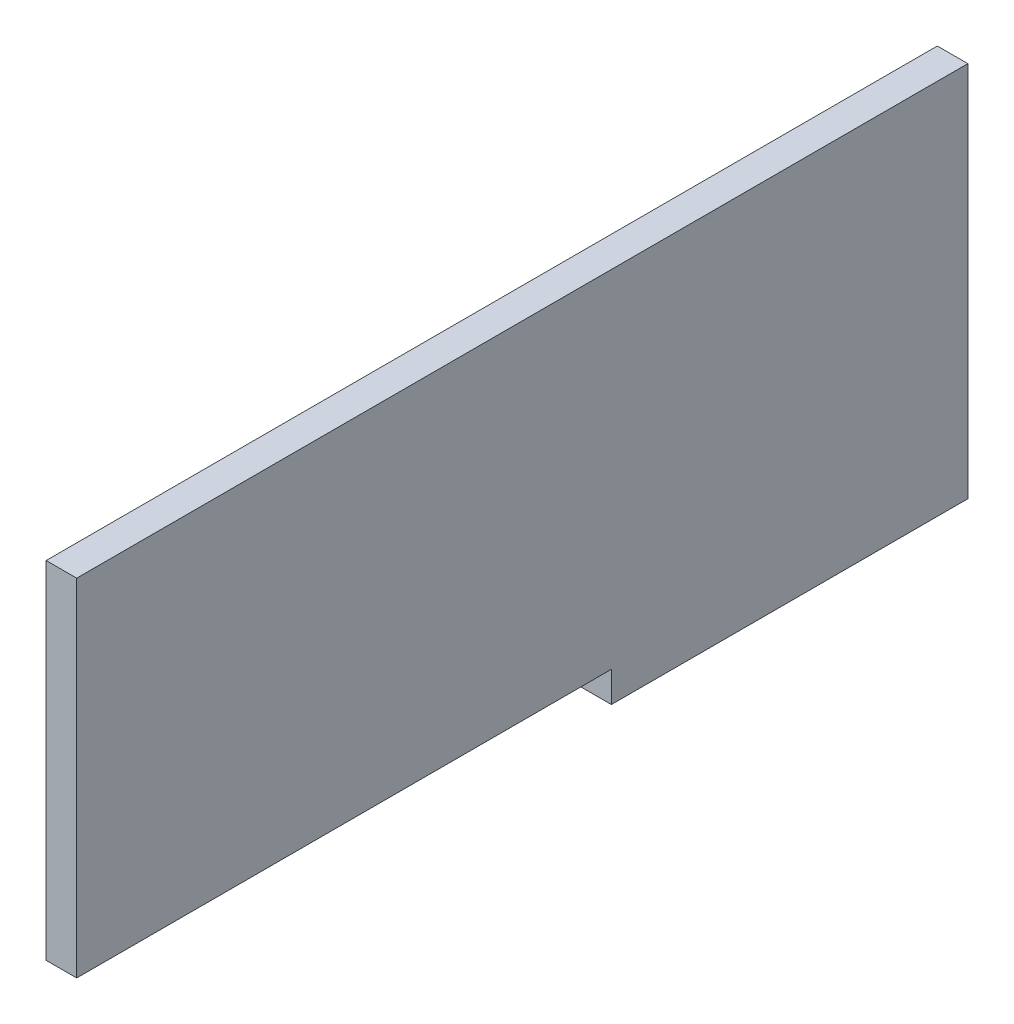
ISO-10303-21;
HEADER;
FILE_DESCRIPTION(('STEP AP214'),'2;1');
FILE_NAME('part.step','',(''),(''),'','','');
FILE_SCHEMA(('AUTOMOTIVE_DESIGN { 1 0 10303 214 1 1 1 1 }'));
ENDSEC;
DATA;
#1=APPLICATION_CONTEXT('core data for automotive mechanical design processes');
#2=APPLICATION_PROTOCOL_DEFINITION('international standard','automotive_design',2000,#1);
#3=PRODUCT_CONTEXT('',#1,'mechanical');
#4=PRODUCT('Part','Part','',(#3));
#5=PRODUCT_RELATED_PRODUCT_CATEGORY('part','',(#4));
#6=PRODUCT_DEFINITION_FORMATION('','',#4);
#7=PRODUCT_DEFINITION_CONTEXT('part definition',#1,'design');
#8=PRODUCT_DEFINITION('design','',#6,#7);
#9=PRODUCT_DEFINITION_SHAPE('','',#8);
#10=(LENGTH_UNIT() NAMED_UNIT(*) SI_UNIT(.MILLI.,.METRE.));
#11=(NAMED_UNIT(*) PLANE_ANGLE_UNIT() SI_UNIT($,.RADIAN.));
#12=(NAMED_UNIT(*) SI_UNIT($,.STERADIAN.) SOLID_ANGLE_UNIT());
#13=UNCERTAINTY_MEASURE_WITH_UNIT(LENGTH_MEASURE(1.E-05),#10,'distance_accuracy_value','');
#14=(GEOMETRIC_REPRESENTATION_CONTEXT(3) GLOBAL_UNCERTAINTY_ASSIGNED_CONTEXT((#13)) GLOBAL_UNIT_ASSIGNED_CONTEXT((#10,
#11,#12)) REPRESENTATION_CONTEXT('',''));
#15=CARTESIAN_POINT('',(0.,0.,0.));
#16=DIRECTION('',(0.,0.,1.));
#17=DIRECTION('',(1.,0.,0.));
#18=AXIS2_PLACEMENT_3D('',#15,#16,#17);
#19=CARTESIAN_POINT('',(6.,34.,87.5));
#20=DIRECTION('',(0.,-1.,0.));
#21=DIRECTION('',(0.,0.,-1.));
#22=AXIS2_PLACEMENT_3D('',#19,#20,#21);
#23=PLANE('',#22);
#24=DIRECTION('',(0.,0.,1.));
#25=VECTOR('',#24,1.);
#26=CARTESIAN_POINT('',(0.,34.,87.5));
#27=LINE('',#26,#25);
#28=CARTESIAN_POINT('',(0.,34.,-87.5));
#29=VERTEX_POINT('',#28);
#30=CARTESIAN_POINT('',(0.,34.,87.5));
#31=VERTEX_POINT('',#30);
#32=EDGE_CURVE('E121',#29,#31,#27,.T.);
#33=ORIENTED_EDGE('',*,*,#32,.T.);
#34=DIRECTION('',(-1.,0.,0.));
#35=VECTOR('',#34,1.);
#36=CARTESIAN_POINT('',(6.,34.,87.5));
#37=LINE('',#36,#35);
#38=CARTESIAN_POINT('',(6.,34.,87.5));
#39=VERTEX_POINT('',#38);
#40=EDGE_CURVE('E41',#39,#31,#37,.T.);
#41=ORIENTED_EDGE('',*,*,#40,.F.);
#42=DIRECTION('',(0.,0.,1.));
#43=VECTOR('',#42,1.);
#44=CARTESIAN_POINT('',(6.,34.,87.5));
#45=LINE('',#44,#43);
#46=CARTESIAN_POINT('',(6.,34.,-87.5));
#47=VERTEX_POINT('',#46);
#48=EDGE_CURVE('E87',#47,#39,#45,.T.);
#49=ORIENTED_EDGE('',*,*,#48,.F.);
#50=DIRECTION('',(-1.,0.,0.));
#51=VECTOR('',#50,1.);
#52=CARTESIAN_POINT('',(6.,34.,-87.5));
#53=LINE('',#52,#51);
#54=EDGE_CURVE('E11',#47,#29,#53,.T.);
#55=ORIENTED_EDGE('',*,*,#54,.T.);
#56=EDGE_LOOP('',(#33,#41,#49,#55));
#57=FACE_BOUND('',#56,.T.);
#58=ADVANCED_FACE('F33',(#57),#23,.F.);
#59=CARTESIAN_POINT('',(6.,-34.,87.5));
#60=DIRECTION('',(0.,0.,-1.));
#61=DIRECTION('',(-1.,0.,0.));
#62=AXIS2_PLACEMENT_3D('',#59,#60,#61);
#63=PLANE('',#62);
#64=DIRECTION('',(0.,-1.,0.));
#65=VECTOR('',#64,1.);
#66=CARTESIAN_POINT('',(0.,-34.,87.5));
#67=LINE('',#66,#65);
#68=CARTESIAN_POINT('',(0.,-34.,87.5));
#69=VERTEX_POINT('',#68);
#70=EDGE_CURVE('E123',#31,#69,#67,.T.);
#71=ORIENTED_EDGE('',*,*,#70,.T.);
#72=DIRECTION('',(-1.,0.,0.));
#73=VECTOR('',#72,1.);
#74=CARTESIAN_POINT('',(6.,-34.,87.5));
#75=LINE('',#74,#73);
#76=CARTESIAN_POINT('',(6.,-34.,87.5));
#77=VERTEX_POINT('',#76);
#78=EDGE_CURVE('E110',#77,#69,#75,.T.);
#79=ORIENTED_EDGE('',*,*,#78,.F.);
#80=DIRECTION('',(0.,-1.,0.));
#81=VECTOR('',#80,1.);
#82=CARTESIAN_POINT('',(6.,-34.,87.5));
#83=LINE('',#82,#81);
#84=EDGE_CURVE('E101',#39,#77,#83,.T.);
#85=ORIENTED_EDGE('',*,*,#84,.F.);
#86=ORIENTED_EDGE('',*,*,#40,.T.);
#87=EDGE_LOOP('',(#71,#79,#85,#86));
#88=FACE_BOUND('',#87,.T.);
#89=ADVANCED_FACE('F135',(#88),#63,.F.);
#90=CARTESIAN_POINT('',(6.,-34.,87.5));
#91=DIRECTION('',(0.,1.,0.));
#92=DIRECTION('',(0.,0.,1.));
#93=AXIS2_PLACEMENT_3D('',#90,#91,#92);
#94=PLANE('',#93);
#95=DIRECTION('',(0.,0.,-1.));
#96=VECTOR('',#95,1.);
#97=CARTESIAN_POINT('',(0.,-34.,87.5));
#98=LINE('',#97,#96);
#99=CARTESIAN_POINT('',(0.,-34.,-17.5));
#100=VERTEX_POINT('',#99);
#101=EDGE_CURVE('E109',#69,#100,#98,.T.);
#102=ORIENTED_EDGE('',*,*,#101,.T.);
#103=DIRECTION('',(-1.,0.,0.));
#104=VECTOR('',#103,1.);
#105=CARTESIAN_POINT('',(6.,-34.,-17.5));
#106=LINE('',#105,#104);
#107=CARTESIAN_POINT('',(6.,-34.,-17.5));
#108=VERTEX_POINT('',#107);
#109=EDGE_CURVE('E106',#108,#100,#106,.T.);
#110=ORIENTED_EDGE('',*,*,#109,.F.);
#111=DIRECTION('',(0.,0.,-1.));
#112=VECTOR('',#111,1.);
#113=CARTESIAN_POINT('',(6.,-34.,87.5));
#114=LINE('',#113,#112);
#115=EDGE_CURVE('E95',#77,#108,#114,.T.);
#116=ORIENTED_EDGE('',*,*,#115,.F.);
#117=ORIENTED_EDGE('',*,*,#78,.T.);
#118=EDGE_LOOP('',(#102,#110,#116,#117));
#119=FACE_BOUND('',#118,.T.);
#120=ADVANCED_FACE('F107',(#119),#94,.F.);
#121=CARTESIAN_POINT('',(6.,-34.,-17.5));
#122=DIRECTION('',(0.,0.,-1.));
#123=DIRECTION('',(-1.,0.,0.));
#124=AXIS2_PLACEMENT_3D('',#121,#122,#123);
#125=PLANE('',#124);
#126=DIRECTION('',(0.,-1.,0.));
#127=VECTOR('',#126,1.);
#128=CARTESIAN_POINT('',(0.,-34.,-17.5));
#129=LINE('',#128,#127);
#130=CARTESIAN_POINT('',(0.,-40.,-17.5));
#131=VERTEX_POINT('',#130);
#132=EDGE_CURVE('E73',#100,#131,#129,.T.);
#133=ORIENTED_EDGE('',*,*,#132,.T.);
#134=DIRECTION('',(-1.,0.,0.));
#135=VECTOR('',#134,1.);
#136=CARTESIAN_POINT('',(6.,-40.,-17.5));
#137=LINE('',#136,#135);
#138=CARTESIAN_POINT('',(6.,-40.,-17.5));
#139=VERTEX_POINT('',#138);
#140=EDGE_CURVE('E111',#139,#131,#137,.T.);
#141=ORIENTED_EDGE('',*,*,#140,.F.);
#142=DIRECTION('',(0.,-1.,0.));
#143=VECTOR('',#142,1.);
#144=CARTESIAN_POINT('',(6.,-34.,-17.5));
#145=LINE('',#144,#143);
#146=EDGE_CURVE('E99',#108,#139,#145,.T.);
#147=ORIENTED_EDGE('',*,*,#146,.F.);
#148=ORIENTED_EDGE('',*,*,#109,.T.);
#149=EDGE_LOOP('',(#133,#141,#147,#148));
#150=FACE_BOUND('',#149,.T.);
#151=ADVANCED_FACE('F113',(#150),#125,.F.);
#152=CARTESIAN_POINT('',(6.,-40.,-87.5));
#153=DIRECTION('',(0.,1.,0.));
#154=DIRECTION('',(0.,0.,1.));
#155=AXIS2_PLACEMENT_3D('',#152,#153,#154);
#156=PLANE('',#155);
#157=DIRECTION('',(0.,0.,-1.));
#158=VECTOR('',#157,1.);
#159=CARTESIAN_POINT('',(0.,-40.,-87.5));
#160=LINE('',#159,#158);
#161=CARTESIAN_POINT('',(0.,-40.,-87.5));
#162=VERTEX_POINT('',#161);
#163=EDGE_CURVE('E80',#131,#162,#160,.T.);
#164=ORIENTED_EDGE('',*,*,#163,.T.);
#165=DIRECTION('',(-1.,0.,0.));
#166=VECTOR('',#165,1.);
#167=CARTESIAN_POINT('',(6.,-40.,-87.5));
#168=LINE('',#167,#166);
#169=CARTESIAN_POINT('',(6.,-40.,-87.5));
#170=VERTEX_POINT('',#169);
#171=EDGE_CURVE('E117',#170,#162,#168,.T.);
#172=ORIENTED_EDGE('',*,*,#171,.F.);
#173=DIRECTION('',(0.,0.,-1.));
#174=VECTOR('',#173,1.);
#175=CARTESIAN_POINT('',(6.,-40.,-87.5));
#176=LINE('',#175,#174);
#177=EDGE_CURVE('E115',#139,#170,#176,.T.);
#178=ORIENTED_EDGE('',*,*,#177,.F.);
#179=ORIENTED_EDGE('',*,*,#140,.T.);
#180=EDGE_LOOP('',(#164,#172,#178,#179));
#181=FACE_BOUND('',#180,.T.);
#182=ADVANCED_FACE('F141',(#181),#156,.F.);
#183=CARTESIAN_POINT('',(6.,-34.,-87.5));
#184=DIRECTION('',(0.,0.,1.));
#185=DIRECTION('',(1.,0.,0.));
#186=AXIS2_PLACEMENT_3D('',#183,#184,#185);
#187=PLANE('',#186);
#188=DIRECTION('',(0.,1.,0.));
#189=VECTOR('',#188,1.);
#190=CARTESIAN_POINT('',(0.,-34.,-87.5));
#191=LINE('',#190,#189);
#192=EDGE_CURVE('E128',#162,#29,#191,.T.);
#193=ORIENTED_EDGE('',*,*,#192,.T.);
#194=ORIENTED_EDGE('',*,*,#54,.F.);
#195=DIRECTION('',(0.,1.,0.));
#196=VECTOR('',#195,1.);
#197=CARTESIAN_POINT('',(6.,-34.,-87.5));
#198=LINE('',#197,#196);
#199=EDGE_CURVE('E49',#170,#47,#198,.T.);
#200=ORIENTED_EDGE('',*,*,#199,.F.);
#201=ORIENTED_EDGE('',*,*,#171,.T.);
#202=EDGE_LOOP('',(#193,#194,#200,#201));
#203=FACE_BOUND('',#202,.T.);
#204=ADVANCED_FACE('F140',(#203),#187,.F.);
#205=CARTESIAN_POINT('',(6.,0.,0.));
#206=DIRECTION('',(-1.,0.,0.));
#207=DIRECTION('',(0.,0.,1.));
#208=AXIS2_PLACEMENT_3D('',#205,#206,#207);
#209=PLANE('',#208);
#210=ORIENTED_EDGE('',*,*,#199,.T.);
#211=ORIENTED_EDGE('',*,*,#48,.T.);
#212=ORIENTED_EDGE('',*,*,#84,.T.);
#213=ORIENTED_EDGE('',*,*,#115,.T.);
#214=ORIENTED_EDGE('',*,*,#146,.T.);
#215=ORIENTED_EDGE('',*,*,#177,.T.);
#216=EDGE_LOOP('',(#210,#211,#212,#213,#214,#215));
#217=FACE_BOUND('',#216,.T.);
#218=ADVANCED_FACE('F97',(#217),#209,.F.);
#219=CARTESIAN_POINT('',(0.,0.,0.));
#220=DIRECTION('',(-1.,0.,0.));
#221=DIRECTION('',(0.,0.,1.));
#222=AXIS2_PLACEMENT_3D('',#219,#220,#221);
#223=PLANE('',#222);
#224=ORIENTED_EDGE('',*,*,#32,.F.);
#225=ORIENTED_EDGE('',*,*,#192,.F.);
#226=ORIENTED_EDGE('',*,*,#163,.F.);
#227=ORIENTED_EDGE('',*,*,#132,.F.);
#228=ORIENTED_EDGE('',*,*,#101,.F.);
#229=ORIENTED_EDGE('',*,*,#70,.F.);
#230=EDGE_LOOP('',(#224,#225,#226,#227,#228,#229));
#231=FACE_BOUND('',#230,.T.);
#232=ADVANCED_FACE('F138',(#231),#223,.T.);
#233=CLOSED_SHELL('',(#58,#89,#120,#151,#182,#204,#218,#232));
#234=MANIFOLD_SOLID_BREP('B2',#233);
#235=ADVANCED_BREP_SHAPE_REPRESENTATION('',(#18,#234),#14);
#236=SHAPE_DEFINITION_REPRESENTATION(#9,#235);
ENDSEC;
END-ISO-10303-21;
